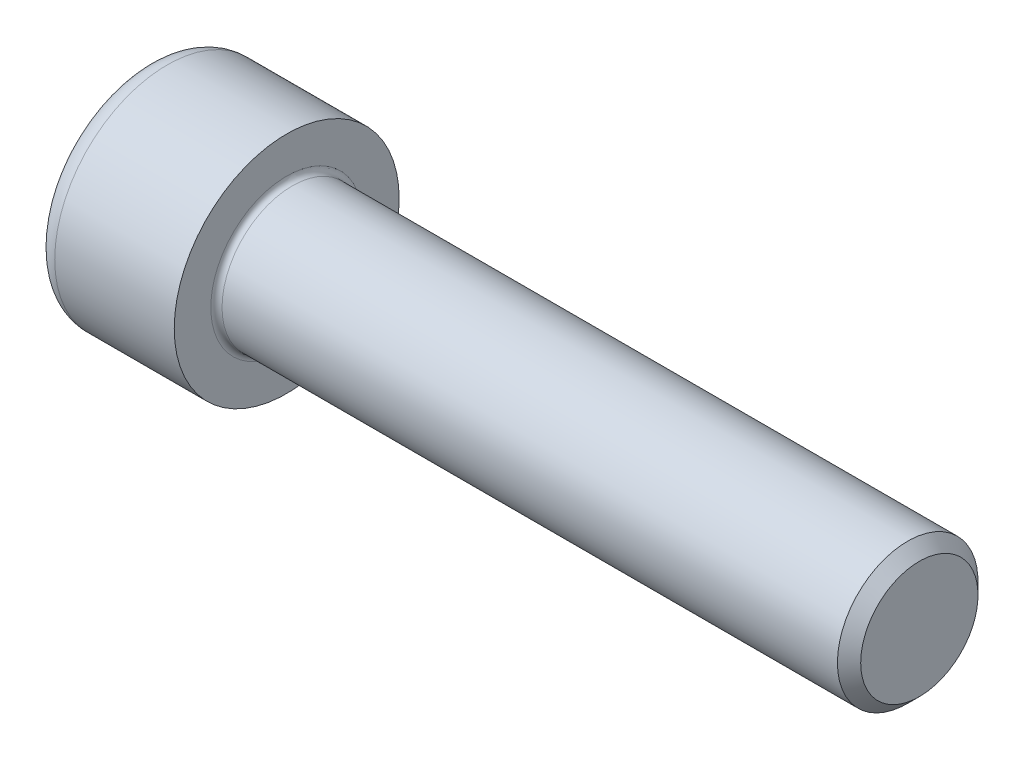
ISO-10303-21;
HEADER;
FILE_DESCRIPTION(('STEP AP214'),'2;1');
FILE_NAME('part.step','',(''),(''),'','','');
FILE_SCHEMA(('AUTOMOTIVE_DESIGN { 1 0 10303 214 1 1 1 1 }'));
ENDSEC;
DATA;
#1=APPLICATION_CONTEXT('core data for automotive mechanical design processes');
#2=APPLICATION_PROTOCOL_DEFINITION('international standard','automotive_design',2000,#1);
#3=PRODUCT_CONTEXT('',#1,'mechanical');
#4=PRODUCT('Part','Part','',(#3));
#5=PRODUCT_RELATED_PRODUCT_CATEGORY('part','',(#4));
#6=PRODUCT_DEFINITION_FORMATION('','',#4);
#7=PRODUCT_DEFINITION_CONTEXT('part definition',#1,'design');
#8=PRODUCT_DEFINITION('design','',#6,#7);
#9=PRODUCT_DEFINITION_SHAPE('','',#8);
#10=(LENGTH_UNIT() NAMED_UNIT(*) SI_UNIT(.MILLI.,.METRE.));
#11=(NAMED_UNIT(*) PLANE_ANGLE_UNIT() SI_UNIT($,.RADIAN.));
#12=(NAMED_UNIT(*) SI_UNIT($,.STERADIAN.) SOLID_ANGLE_UNIT());
#13=UNCERTAINTY_MEASURE_WITH_UNIT(LENGTH_MEASURE(1.E-05),#10,'distance_accuracy_value','');
#14=(GEOMETRIC_REPRESENTATION_CONTEXT(3) GLOBAL_UNCERTAINTY_ASSIGNED_CONTEXT((#13)) GLOBAL_UNIT_ASSIGNED_CONTEXT((#10,
#11,#12)) REPRESENTATION_CONTEXT('',''));
#15=CARTESIAN_POINT('',(0.,0.,0.));
#16=DIRECTION('',(0.,0.,1.));
#17=DIRECTION('',(1.,0.,0.));
#18=AXIS2_PLACEMENT_3D('',#15,#16,#17);
#19=CARTESIAN_POINT('',(0.,0.,0.));
#20=DIRECTION('',(-1.,0.,0.));
#21=DIRECTION('',(0.,0.,1.));
#22=AXIS2_PLACEMENT_3D('',#19,#20,#21);
#23=PLANE('',#22);
#24=DIRECTION('',(0.,-0.499999999999999,0.866025403784439));
#25=VECTOR('',#24,1.);
#26=CARTESIAN_POINT('',(0.,4.68519743447381,0.));
#27=LINE('',#26,#25);
#28=CARTESIAN_POINT('',(0.,4.68519743447381,0.));
#29=VERTEX_POINT('',#28);
#30=CARTESIAN_POINT('',(0.,2.34259871723691,4.05749999999999));
#31=VERTEX_POINT('',#30);
#32=EDGE_CURVE('E261',#29,#31,#27,.T.);
#33=ORIENTED_EDGE('',*,*,#32,.T.);
#34=DIRECTION('',(0.,1.,0.));
#35=VECTOR('',#34,1.);
#36=CARTESIAN_POINT('',(0.,-2.34259871723691,4.0575));
#37=LINE('',#36,#35);
#38=CARTESIAN_POINT('',(0.,-2.34259871723691,4.0575));
#39=VERTEX_POINT('',#38);
#40=EDGE_CURVE('E133',#39,#31,#37,.T.);
#41=ORIENTED_EDGE('',*,*,#40,.F.);
#42=DIRECTION('',(0.,-0.500000000000001,-0.866025403784438));
#43=VECTOR('',#42,1.);
#44=CARTESIAN_POINT('',(0.,-2.34259871723691,4.0575));
#45=LINE('',#44,#43);
#46=CARTESIAN_POINT('',(0.,-4.68519743447382,0.));
#47=VERTEX_POINT('',#46);
#48=EDGE_CURVE('E264',#39,#47,#45,.T.);
#49=ORIENTED_EDGE('',*,*,#48,.T.);
#50=DIRECTION('',(0.,0.499999999999999,-0.866025403784439));
#51=VECTOR('',#50,1.);
#52=CARTESIAN_POINT('',(0.,-4.68519743447382,0.));
#53=LINE('',#52,#51);
#54=CARTESIAN_POINT('',(0.,-2.34259871723692,-4.0575));
#55=VERTEX_POINT('',#54);
#56=EDGE_CURVE('E267',#47,#55,#53,.T.);
#57=ORIENTED_EDGE('',*,*,#56,.T.);
#58=DIRECTION('',(0.,-1.,0.));
#59=VECTOR('',#58,1.);
#60=CARTESIAN_POINT('',(0.,2.3425987172369,-4.05750000000001));
#61=LINE('',#60,#59);
#62=CARTESIAN_POINT('',(0.,2.3425987172369,-4.05750000000001));
#63=VERTEX_POINT('',#62);
#64=EDGE_CURVE('E270',#63,#55,#61,.T.);
#65=ORIENTED_EDGE('',*,*,#64,.F.);
#66=DIRECTION('',(0.,-0.500000000000001,-0.866025403784438));
#67=VECTOR('',#66,1.);
#68=CARTESIAN_POINT('',(0.,4.68519743447381,0.));
#69=LINE('',#68,#67);
#70=EDGE_CURVE('E128',#29,#63,#69,.T.);
#71=ORIENTED_EDGE('',*,*,#70,.F.);
#72=EDGE_LOOP('',(#33,#41,#49,#57,#65,#71));
#73=FACE_BOUND('',#72,.T.);
#74=CARTESIAN_POINT('',(0.,0.,0.));
#75=DIRECTION('',(-1.,0.,0.));
#76=DIRECTION('',(0.,0.,1.));
#77=AXIS2_PLACEMENT_3D('',#74,#75,#76);
#78=CIRCLE('',#77,6.5);
#79=CARTESIAN_POINT('',(0.,0.,6.5));
#80=VERTEX_POINT('',#79);
#81=EDGE_CURVE('E45',#80,#80,#78,.T.);
#82=ORIENTED_EDGE('',*,*,#81,.T.);
#83=EDGE_LOOP('',(#82));
#84=FACE_BOUND('',#83,.T.);
#85=ADVANCED_FACE('F37',(#73,#84),#23,.T.);
#86=CARTESIAN_POINT('',(-31.75,0.,0.));
#87=DIRECTION('',(-1.,0.,0.));
#88=DIRECTION('',(0.,0.,1.));
#89=AXIS2_PLACEMENT_3D('',#86,#87,#88);
#90=CYLINDRICAL_SURFACE('',#89,8.);
#91=CARTESIAN_POINT('',(1.5,0.,0.));
#92=DIRECTION('',(-1.,0.,0.));
#93=DIRECTION('',(0.,0.,1.));
#94=AXIS2_PLACEMENT_3D('',#91,#92,#93);
#95=CIRCLE('',#94,8.);
#96=CARTESIAN_POINT('',(1.5,0.,8.));
#97=VERTEX_POINT('',#96);
#98=EDGE_CURVE('E11',#97,#97,#95,.F.);
#99=ORIENTED_EDGE('',*,*,#98,.T.);
#100=EDGE_LOOP('',(#99));
#101=FACE_BOUND('',#100,.T.);
#102=CARTESIAN_POINT('',(10.,0.,0.));
#103=DIRECTION('',(-1.,0.,0.));
#104=DIRECTION('',(0.,0.,1.));
#105=AXIS2_PLACEMENT_3D('',#102,#103,#104);
#106=CIRCLE('',#105,8.);
#107=CARTESIAN_POINT('',(10.,0.,8.));
#108=VERTEX_POINT('',#107);
#109=EDGE_CURVE('E151',#108,#108,#106,.T.);
#110=ORIENTED_EDGE('',*,*,#109,.T.);
#111=EDGE_LOOP('',(#110));
#112=FACE_BOUND('',#111,.T.);
#113=ADVANCED_FACE('F175',(#101,#112),#90,.T.);
#114=CARTESIAN_POINT('',(10.,8.,0.));
#115=DIRECTION('',(1.,0.,0.));
#116=DIRECTION('',(0.,0.,-1.));
#117=AXIS2_PLACEMENT_3D('',#114,#115,#116);
#118=PLANE('',#117);
#119=CARTESIAN_POINT('',(10.,0.,0.));
#120=DIRECTION('',(1.,0.,0.));
#121=DIRECTION('',(0.,0.,-1.));
#122=AXIS2_PLACEMENT_3D('',#119,#120,#121);
#123=CIRCLE('',#122,5.4);
#124=CARTESIAN_POINT('',(10.,0.,-5.4));
#125=VERTEX_POINT('',#124);
#126=EDGE_CURVE('E154',#125,#125,#123,.F.);
#127=ORIENTED_EDGE('',*,*,#126,.T.);
#128=EDGE_LOOP('',(#127));
#129=FACE_BOUND('',#128,.T.);
#130=ORIENTED_EDGE('',*,*,#109,.F.);
#131=EDGE_LOOP('',(#130));
#132=FACE_BOUND('',#131,.T.);
#133=ADVANCED_FACE('F181',(#129,#132),#118,.T.);
#134=CARTESIAN_POINT('',(-31.75,0.,0.));
#135=DIRECTION('',(-1.,0.,0.));
#136=DIRECTION('',(0.,0.,1.));
#137=AXIS2_PLACEMENT_3D('',#134,#135,#136);
#138=CYLINDRICAL_SURFACE('',#137,5.);
#139=CARTESIAN_POINT('',(10.4,0.,0.));
#140=DIRECTION('',(1.,0.,0.));
#141=DIRECTION('',(0.,0.,-1.));
#142=AXIS2_PLACEMENT_3D('',#139,#140,#141);
#143=CIRCLE('',#142,5.);
#144=CARTESIAN_POINT('',(10.4,0.,-5.));
#145=VERTEX_POINT('',#144);
#146=EDGE_CURVE('E157',#145,#145,#143,.T.);
#147=ORIENTED_EDGE('',*,*,#146,.T.);
#148=EDGE_LOOP('',(#147));
#149=FACE_BOUND('',#148,.T.);
#150=CARTESIAN_POINT('',(54.172,0.,0.));
#151=DIRECTION('',(-1.,0.,0.));
#152=DIRECTION('',(0.,0.,1.));
#153=AXIS2_PLACEMENT_3D('',#150,#151,#152);
#154=CIRCLE('',#153,5.);
#155=CARTESIAN_POINT('',(54.172,0.,5.));
#156=VERTEX_POINT('',#155);
#157=EDGE_CURVE('E148',#156,#156,#154,.T.);
#158=ORIENTED_EDGE('',*,*,#157,.T.);
#159=EDGE_LOOP('',(#158));
#160=FACE_BOUND('',#159,.T.);
#161=ADVANCED_FACE('F187',(#149,#160),#138,.T.);
#162=CARTESIAN_POINT('',(55.,0.,0.));
#163=DIRECTION('',(-1.,0.,0.));
#164=DIRECTION('',(0.,0.,1.));
#165=AXIS2_PLACEMENT_3D('',#162,#163,#164);
#166=CONICAL_SURFACE('',#165,4.172,0.785398163397469);
#167=ORIENTED_EDGE('',*,*,#157,.F.);
#168=EDGE_LOOP('',(#167));
#169=FACE_BOUND('',#168,.T.);
#170=CARTESIAN_POINT('',(55.,0.,0.));
#171=DIRECTION('',(-1.,0.,0.));
#172=DIRECTION('',(0.,0.,1.));
#173=AXIS2_PLACEMENT_3D('',#170,#171,#172);
#174=CIRCLE('',#173,4.172);
#175=CARTESIAN_POINT('',(55.,0.,4.172));
#176=VERTEX_POINT('',#175);
#177=EDGE_CURVE('E144',#176,#176,#174,.T.);
#178=ORIENTED_EDGE('',*,*,#177,.T.);
#179=EDGE_LOOP('',(#178));
#180=FACE_BOUND('',#179,.T.);
#181=ADVANCED_FACE('F191',(#169,#180),#166,.T.);
#182=CARTESIAN_POINT('',(55.,4.172,0.));
#183=DIRECTION('',(1.,0.,0.));
#184=DIRECTION('',(0.,0.,-1.));
#185=AXIS2_PLACEMENT_3D('',#182,#183,#184);
#186=PLANE('',#185);
#187=ORIENTED_EDGE('',*,*,#177,.F.);
#188=EDGE_LOOP('',(#187));
#189=FACE_BOUND('',#188,.T.);
#190=ADVANCED_FACE('F171',(#189),#186,.T.);
#191=CARTESIAN_POINT('',(10.4,0.,0.));
#192=DIRECTION('',(1.,0.,0.));
#193=DIRECTION('',(0.,0.,-1.));
#194=AXIS2_PLACEMENT_3D('',#191,#192,#193);
#195=TOROIDAL_SURFACE('',#194,5.4,0.4);
#196=ORIENTED_EDGE('',*,*,#146,.F.);
#197=EDGE_LOOP('',(#196));
#198=FACE_BOUND('',#197,.T.);
#199=ORIENTED_EDGE('',*,*,#126,.F.);
#200=EDGE_LOOP('',(#199));
#201=FACE_BOUND('',#200,.T.);
#202=ADVANCED_FACE('F164',(#198,#201),#195,.F.);
#203=CARTESIAN_POINT('',(1.5,0.,0.));
#204=DIRECTION('',(-1.,0.,0.));
#205=DIRECTION('',(0.,0.,1.));
#206=AXIS2_PLACEMENT_3D('',#203,#204,#205);
#207=TOROIDAL_SURFACE('',#206,6.5,1.5);
#208=ORIENTED_EDGE('',*,*,#98,.F.);
#209=EDGE_LOOP('',(#208));
#210=FACE_BOUND('',#209,.T.);
#211=ORIENTED_EDGE('',*,*,#81,.F.);
#212=EDGE_LOOP('',(#211));
#213=FACE_BOUND('',#212,.T.);
#214=ADVANCED_FACE('F39',(#210,#213),#207,.T.);
#215=CARTESIAN_POINT('',(5.,4.68519743447381,0.));
#216=DIRECTION('',(0.,-0.866025403784439,-0.5));
#217=DIRECTION('',(0.,0.5,-0.866025403784439));
#218=AXIS2_PLACEMENT_3D('',#215,#216,#217);
#219=PLANE('',#218);
#220=ORIENTED_EDGE('',*,*,#32,.F.);
#221=DIRECTION('',(-1.,0.,0.));
#222=VECTOR('',#221,1.);
#223=CARTESIAN_POINT('',(5.,4.68519743447381,0.));
#224=LINE('',#223,#222);
#225=CARTESIAN_POINT('',(5.,4.68519743447381,0.));
#226=VERTEX_POINT('',#225);
#227=EDGE_CURVE('E251',#226,#29,#224,.T.);
#228=ORIENTED_EDGE('',*,*,#227,.F.);
#229=DIRECTION('',(0.,-0.499999999999999,0.866025403784439));
#230=VECTOR('',#229,1.);
#231=CARTESIAN_POINT('',(5.,4.68519743447381,0.));
#232=LINE('',#231,#230);
#233=CARTESIAN_POINT('',(5.,3.51389807585536,2.02875));
#234=VERTEX_POINT('',#233);
#235=EDGE_CURVE('E120',#226,#234,#232,.T.);
#236=ORIENTED_EDGE('',*,*,#235,.T.);
#237=CARTESIAN_POINT('',(5.,2.34259871723691,4.05749999999999));
#238=VERTEX_POINT('',#237);
#239=EDGE_CURVE('E111',#234,#238,#232,.T.);
#240=ORIENTED_EDGE('',*,*,#239,.T.);
#241=DIRECTION('',(-1.,0.,0.));
#242=VECTOR('',#241,1.);
#243=CARTESIAN_POINT('',(5.,2.34259871723691,4.05749999999999));
#244=LINE('',#243,#242);
#245=EDGE_CURVE('E125',#238,#31,#244,.T.);
#246=ORIENTED_EDGE('',*,*,#245,.T.);
#247=EDGE_LOOP('',(#220,#228,#236,#240,#246));
#248=FACE_BOUND('',#247,.T.);
#249=ADVANCED_FACE('F124',(#248),#219,.T.);
#250=CARTESIAN_POINT('',(5.,-2.34259871723691,4.0575));
#251=DIRECTION('',(0.,0.,1.));
#252=DIRECTION('',(0.,-1.,0.));
#253=AXIS2_PLACEMENT_3D('',#250,#251,#252);
#254=PLANE('',#253);
#255=ORIENTED_EDGE('',*,*,#40,.T.);
#256=ORIENTED_EDGE('',*,*,#245,.F.);
#257=DIRECTION('',(0.,1.,0.));
#258=VECTOR('',#257,1.);
#259=CARTESIAN_POINT('',(5.,-2.34259871723691,4.0575));
#260=LINE('',#259,#258);
#261=CARTESIAN_POINT('',(5.,0.,4.0575));
#262=VERTEX_POINT('',#261);
#263=EDGE_CURVE('E108',#262,#238,#260,.T.);
#264=ORIENTED_EDGE('',*,*,#263,.F.);
#265=CARTESIAN_POINT('',(5.,-2.34259871723691,4.0575));
#266=VERTEX_POINT('',#265);
#267=EDGE_CURVE('E119',#266,#262,#260,.T.);
#268=ORIENTED_EDGE('',*,*,#267,.F.);
#269=DIRECTION('',(-1.,0.,0.));
#270=VECTOR('',#269,1.);
#271=CARTESIAN_POINT('',(5.,-2.34259871723691,4.0575));
#272=LINE('',#271,#270);
#273=EDGE_CURVE('E135',#266,#39,#272,.T.);
#274=ORIENTED_EDGE('',*,*,#273,.T.);
#275=EDGE_LOOP('',(#255,#256,#264,#268,#274));
#276=FACE_BOUND('',#275,.T.);
#277=ADVANCED_FACE('F130',(#276),#254,.F.);
#278=CARTESIAN_POINT('',(5.,-2.34259871723691,4.0575));
#279=DIRECTION('',(0.,0.866025403784438,-0.500000000000001));
#280=DIRECTION('',(0.,0.500000000000001,0.866025403784438));
#281=AXIS2_PLACEMENT_3D('',#278,#279,#280);
#282=PLANE('',#281);
#283=ORIENTED_EDGE('',*,*,#48,.F.);
#284=ORIENTED_EDGE('',*,*,#273,.F.);
#285=DIRECTION('',(0.,-0.500000000000001,-0.866025403784438));
#286=VECTOR('',#285,1.);
#287=CARTESIAN_POINT('',(5.,-2.34259871723691,4.0575));
#288=LINE('',#287,#286);
#289=CARTESIAN_POINT('',(5.,-3.51389807585536,2.02875000000001));
#290=VERTEX_POINT('',#289);
#291=EDGE_CURVE('E290',#266,#290,#288,.T.);
#292=ORIENTED_EDGE('',*,*,#291,.T.);
#293=CARTESIAN_POINT('',(5.,-4.68519743447382,0.));
#294=VERTEX_POINT('',#293);
#295=EDGE_CURVE('E279',#290,#294,#288,.T.);
#296=ORIENTED_EDGE('',*,*,#295,.T.);
#297=DIRECTION('',(-1.,0.,0.));
#298=VECTOR('',#297,1.);
#299=CARTESIAN_POINT('',(5.,-4.68519743447382,0.));
#300=LINE('',#299,#298);
#301=EDGE_CURVE('E140',#294,#47,#300,.T.);
#302=ORIENTED_EDGE('',*,*,#301,.T.);
#303=EDGE_LOOP('',(#283,#284,#292,#296,#302));
#304=FACE_BOUND('',#303,.T.);
#305=ADVANCED_FACE('F205',(#304),#282,.T.);
#306=CARTESIAN_POINT('',(5.,-4.68519743447382,0.));
#307=DIRECTION('',(0.,0.866025403784439,0.499999999999999));
#308=DIRECTION('',(0.,-0.499999999999999,0.866025403784439));
#309=AXIS2_PLACEMENT_3D('',#306,#307,#308);
#310=PLANE('',#309);
#311=ORIENTED_EDGE('',*,*,#56,.F.);
#312=ORIENTED_EDGE('',*,*,#301,.F.);
#313=DIRECTION('',(0.,0.499999999999999,-0.866025403784439));
#314=VECTOR('',#313,1.);
#315=CARTESIAN_POINT('',(5.,-4.68519743447382,0.));
#316=LINE('',#315,#314);
#317=CARTESIAN_POINT('',(5.,-3.51389807585537,-2.02875));
#318=VERTEX_POINT('',#317);
#319=EDGE_CURVE('E257',#294,#318,#316,.T.);
#320=ORIENTED_EDGE('',*,*,#319,.T.);
#321=CARTESIAN_POINT('',(5.,-2.34259871723692,-4.0575));
#322=VERTEX_POINT('',#321);
#323=EDGE_CURVE('E289',#318,#322,#316,.T.);
#324=ORIENTED_EDGE('',*,*,#323,.T.);
#325=DIRECTION('',(-1.,0.,0.));
#326=VECTOR('',#325,1.);
#327=CARTESIAN_POINT('',(5.,-2.34259871723692,-4.0575));
#328=LINE('',#327,#326);
#329=EDGE_CURVE('E250',#322,#55,#328,.T.);
#330=ORIENTED_EDGE('',*,*,#329,.T.);
#331=EDGE_LOOP('',(#311,#312,#320,#324,#330));
#332=FACE_BOUND('',#331,.T.);
#333=ADVANCED_FACE('F208',(#332),#310,.T.);
#334=CARTESIAN_POINT('',(5.,2.3425987172369,-4.05750000000001));
#335=DIRECTION('',(0.,0.,-1.));
#336=DIRECTION('',(0.,1.,0.));
#337=AXIS2_PLACEMENT_3D('',#334,#335,#336);
#338=PLANE('',#337);
#339=ORIENTED_EDGE('',*,*,#64,.T.);
#340=ORIENTED_EDGE('',*,*,#329,.F.);
#341=DIRECTION('',(0.,-1.,0.));
#342=VECTOR('',#341,1.);
#343=CARTESIAN_POINT('',(5.,2.3425987172369,-4.05750000000001));
#344=LINE('',#343,#342);
#345=CARTESIAN_POINT('',(5.,0.,-4.0575));
#346=VERTEX_POINT('',#345);
#347=EDGE_CURVE('E254',#346,#322,#344,.T.);
#348=ORIENTED_EDGE('',*,*,#347,.F.);
#349=CARTESIAN_POINT('',(5.,2.3425987172369,-4.05750000000001));
#350=VERTEX_POINT('',#349);
#351=EDGE_CURVE('E52',#350,#346,#344,.T.);
#352=ORIENTED_EDGE('',*,*,#351,.F.);
#353=DIRECTION('',(-1.,0.,0.));
#354=VECTOR('',#353,1.);
#355=CARTESIAN_POINT('',(5.,2.3425987172369,-4.05750000000001));
#356=LINE('',#355,#354);
#357=EDGE_CURVE('E247',#350,#63,#356,.T.);
#358=ORIENTED_EDGE('',*,*,#357,.T.);
#359=EDGE_LOOP('',(#339,#340,#348,#352,#358));
#360=FACE_BOUND('',#359,.T.);
#361=ADVANCED_FACE('F212',(#360),#338,.F.);
#362=CARTESIAN_POINT('',(5.,4.68519743447381,0.));
#363=DIRECTION('',(0.,0.866025403784438,-0.500000000000001));
#364=DIRECTION('',(0.,0.500000000000001,0.866025403784438));
#365=AXIS2_PLACEMENT_3D('',#362,#363,#364);
#366=PLANE('',#365);
#367=ORIENTED_EDGE('',*,*,#70,.T.);
#368=ORIENTED_EDGE('',*,*,#357,.F.);
#369=DIRECTION('',(0.,-0.500000000000001,-0.866025403784438));
#370=VECTOR('',#369,1.);
#371=CARTESIAN_POINT('',(5.,4.68519743447381,0.));
#372=LINE('',#371,#370);
#373=CARTESIAN_POINT('',(5.,3.51389807585536,-2.02875000000001));
#374=VERTEX_POINT('',#373);
#375=EDGE_CURVE('E237',#374,#350,#372,.T.);
#376=ORIENTED_EDGE('',*,*,#375,.F.);
#377=EDGE_CURVE('E243',#226,#374,#372,.T.);
#378=ORIENTED_EDGE('',*,*,#377,.F.);
#379=ORIENTED_EDGE('',*,*,#227,.T.);
#380=EDGE_LOOP('',(#367,#368,#376,#378,#379));
#381=FACE_BOUND('',#380,.T.);
#382=ADVANCED_FACE('F216',(#381),#366,.F.);
#383=CARTESIAN_POINT('',(5.,4.68519743447381,0.));
#384=DIRECTION('',(1.,0.,0.));
#385=DIRECTION('',(0.,0.,-1.));
#386=AXIS2_PLACEMENT_3D('',#383,#384,#385);
#387=PLANE('',#386);
#388=ORIENTED_EDGE('',*,*,#347,.T.);
#389=ORIENTED_EDGE('',*,*,#323,.F.);
#390=CARTESIAN_POINT('',(5.,0.,0.));
#391=DIRECTION('',(-1.,0.,0.));
#392=DIRECTION('',(0.,0.,1.));
#393=AXIS2_PLACEMENT_3D('',#390,#391,#392);
#394=CIRCLE('',#393,4.0575);
#395=EDGE_CURVE('E285',#346,#318,#394,.T.);
#396=ORIENTED_EDGE('',*,*,#395,.F.);
#397=EDGE_LOOP('',(#388,#389,#396));
#398=FACE_BOUND('',#397,.T.);
#399=ADVANCED_FACE('F220',(#398),#387,.F.);
#400=ORIENTED_EDGE('',*,*,#319,.F.);
#401=ORIENTED_EDGE('',*,*,#295,.F.);
#402=EDGE_CURVE('E138',#318,#290,#394,.T.);
#403=ORIENTED_EDGE('',*,*,#402,.F.);
#404=EDGE_LOOP('',(#400,#401,#403));
#405=FACE_BOUND('',#404,.T.);
#406=ADVANCED_FACE('F223',(#405),#387,.F.);
#407=ORIENTED_EDGE('',*,*,#291,.F.);
#408=ORIENTED_EDGE('',*,*,#267,.T.);
#409=EDGE_CURVE('E134',#290,#262,#394,.T.);
#410=ORIENTED_EDGE('',*,*,#409,.F.);
#411=EDGE_LOOP('',(#407,#408,#410));
#412=FACE_BOUND('',#411,.T.);
#413=ADVANCED_FACE('F228',(#412),#387,.F.);
#414=ORIENTED_EDGE('',*,*,#263,.T.);
#415=ORIENTED_EDGE('',*,*,#239,.F.);
#416=EDGE_CURVE('E114',#262,#234,#394,.T.);
#417=ORIENTED_EDGE('',*,*,#416,.F.);
#418=EDGE_LOOP('',(#414,#415,#417));
#419=FACE_BOUND('',#418,.T.);
#420=ADVANCED_FACE('F110',(#419),#387,.F.);
#421=ORIENTED_EDGE('',*,*,#235,.F.);
#422=ORIENTED_EDGE('',*,*,#377,.T.);
#423=EDGE_CURVE('E145',#234,#374,#394,.T.);
#424=ORIENTED_EDGE('',*,*,#423,.F.);
#425=EDGE_LOOP('',(#421,#422,#424));
#426=FACE_BOUND('',#425,.T.);
#427=ADVANCED_FACE('F231',(#426),#387,.F.);
#428=ORIENTED_EDGE('',*,*,#375,.T.);
#429=ORIENTED_EDGE('',*,*,#351,.T.);
#430=EDGE_CURVE('E240',#374,#346,#394,.T.);
#431=ORIENTED_EDGE('',*,*,#430,.F.);
#432=EDGE_LOOP('',(#428,#429,#431));
#433=FACE_BOUND('',#432,.T.);
#434=ADVANCED_FACE('F201',(#433),#387,.F.);
#435=CARTESIAN_POINT('',(5.,0.,0.));
#436=DIRECTION('',(-1.,0.,0.));
#437=DIRECTION('',(0.,0.,1.));
#438=AXIS2_PLACEMENT_3D('',#435,#436,#437);
#439=CONICAL_SURFACE('',#438,4.0575,1.04719755119659);
#440=CARTESIAN_POINT('',(7.34259871723693,0.,0.));
#441=VERTEX_POINT('',#440);
#442=VERTEX_LOOP('',#441);
#443=FACE_BOUND('',#442,.T.);
#444=ORIENTED_EDGE('',*,*,#416,.T.);
#445=ORIENTED_EDGE('',*,*,#423,.T.);
#446=ORIENTED_EDGE('',*,*,#430,.T.);
#447=ORIENTED_EDGE('',*,*,#395,.T.);
#448=ORIENTED_EDGE('',*,*,#402,.T.);
#449=ORIENTED_EDGE('',*,*,#409,.T.);
#450=EDGE_LOOP('',(#444,#445,#446,#447,#448,#449));
#451=FACE_BOUND('',#450,.T.);
#452=ADVANCED_FACE('F199',(#443,#451),#439,.F.);
#453=CLOSED_SHELL('',(#85,#113,#133,#161,#181,#190,#202,#214,#249,#277,#305,#333,#361,#382,#399,
#406,#413,#420,#427,#434,#452));
#454=MANIFOLD_SOLID_BREP('B2',#453);
#455=ADVANCED_BREP_SHAPE_REPRESENTATION('',(#18,#454),#14);
#456=SHAPE_DEFINITION_REPRESENTATION(#9,#455);
ENDSEC;
END-ISO-10303-21;
